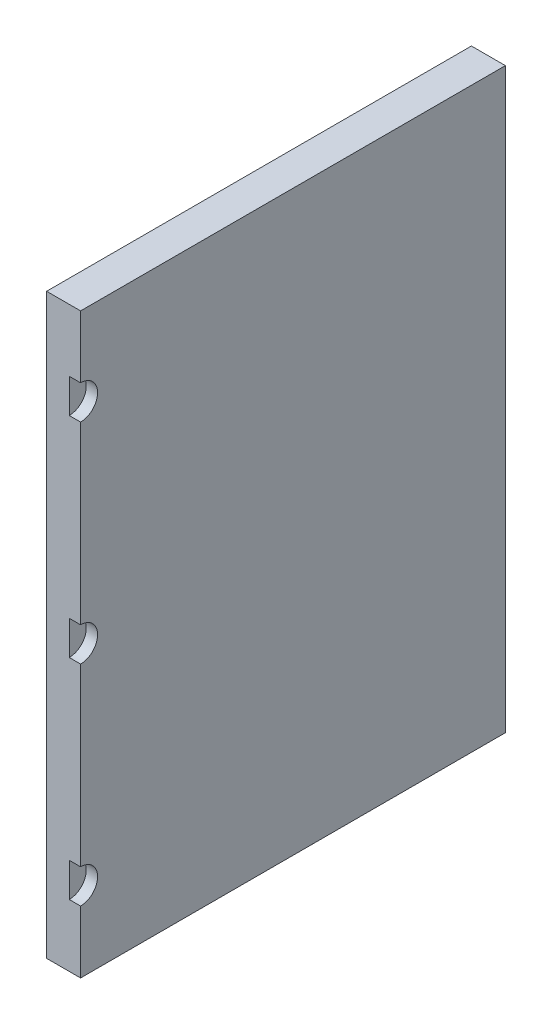
ISO-10303-21;
HEADER;
FILE_DESCRIPTION(('STEP AP214'),'2;1');
FILE_NAME('part.step','',(''),(''),'','','');
FILE_SCHEMA(('AUTOMOTIVE_DESIGN { 1 0 10303 214 1 1 1 1 }'));
ENDSEC;
DATA;
#1=APPLICATION_CONTEXT('core data for automotive mechanical design processes');
#2=APPLICATION_PROTOCOL_DEFINITION('international standard','automotive_design',2000,#1);
#3=PRODUCT_CONTEXT('',#1,'mechanical');
#4=PRODUCT('Part','Part','',(#3));
#5=PRODUCT_RELATED_PRODUCT_CATEGORY('part','',(#4));
#6=PRODUCT_DEFINITION_FORMATION('','',#4);
#7=PRODUCT_DEFINITION_CONTEXT('part definition',#1,'design');
#8=PRODUCT_DEFINITION('design','',#6,#7);
#9=PRODUCT_DEFINITION_SHAPE('','',#8);
#10=(LENGTH_UNIT() NAMED_UNIT(*) SI_UNIT(.MILLI.,.METRE.));
#11=(NAMED_UNIT(*) PLANE_ANGLE_UNIT() SI_UNIT($,.RADIAN.));
#12=(NAMED_UNIT(*) SI_UNIT($,.STERADIAN.) SOLID_ANGLE_UNIT());
#13=UNCERTAINTY_MEASURE_WITH_UNIT(LENGTH_MEASURE(1.E-05),#10,'distance_accuracy_value','');
#14=(GEOMETRIC_REPRESENTATION_CONTEXT(3) GLOBAL_UNCERTAINTY_ASSIGNED_CONTEXT((#13)) GLOBAL_UNIT_ASSIGNED_CONTEXT((#10,
#11,#12)) REPRESENTATION_CONTEXT('',''));
#15=CARTESIAN_POINT('',(0.,0.,0.));
#16=DIRECTION('',(0.,0.,1.));
#17=DIRECTION('',(1.,0.,0.));
#18=AXIS2_PLACEMENT_3D('',#15,#16,#17);
#19=CARTESIAN_POINT('',(4.,12.,39.));
#20=DIRECTION('',(1.,0.,0.));
#21=DIRECTION('',(0.,1.,0.));
#22=AXIS2_PLACEMENT_3D('',#19,#20,#21);
#23=PLANE('',#22);
#24=CARTESIAN_POINT('',(4.,12.,39.));
#25=DIRECTION('',(1.,0.,0.));
#26=DIRECTION('',(0.,1.,0.));
#27=AXIS2_PLACEMENT_3D('',#24,#25,#26);
#28=CIRCLE('',#27,1.5);
#29=CARTESIAN_POINT('',(4.,10.5,39.));
#30=VERTEX_POINT('',#29);
#31=CARTESIAN_POINT('',(4.,13.5,39.));
#32=VERTEX_POINT('',#31);
#33=EDGE_CURVE('E9',#30,#32,#28,.T.);
#34=ORIENTED_EDGE('',*,*,#33,.T.);
#35=DIRECTION('',(0.,1.,0.));
#36=VECTOR('',#35,1.);
#37=CARTESIAN_POINT('',(4.,8.5,39.));
#38=LINE('',#37,#36);
#39=EDGE_CURVE('E171',#30,#32,#38,.T.);
#40=ORIENTED_EDGE('',*,*,#39,.F.);
#41=EDGE_LOOP('',(#34,#40));
#42=FACE_BOUND('',#41,.T.);
#43=ADVANCED_FACE('F15',(#42),#23,.T.);
#44=CARTESIAN_POINT('',(4.,12.,39.));
#45=DIRECTION('',(-1.,0.,0.));
#46=DIRECTION('',(0.,1.,0.));
#47=AXIS2_PLACEMENT_3D('',#44,#45,#46);
#48=CYLINDRICAL_SURFACE('',#47,1.5);
#49=DIRECTION('',(1.,0.,0.));
#50=VECTOR('',#49,1.);
#51=CARTESIAN_POINT('',(4.,13.5,39.));
#52=LINE('',#51,#50);
#53=CARTESIAN_POINT('',(5.,13.5,39.));
#54=VERTEX_POINT('',#53);
#55=EDGE_CURVE('E166',#32,#54,#52,.T.);
#56=ORIENTED_EDGE('',*,*,#55,.F.);
#57=ORIENTED_EDGE('',*,*,#33,.F.);
#58=DIRECTION('',(-1.,0.,0.));
#59=VECTOR('',#58,1.);
#60=CARTESIAN_POINT('',(4.,10.5,39.));
#61=LINE('',#60,#59);
#62=CARTESIAN_POINT('',(5.,10.5,39.));
#63=VERTEX_POINT('',#62);
#64=EDGE_CURVE('E165',#63,#30,#61,.T.);
#65=ORIENTED_EDGE('',*,*,#64,.F.);
#66=CARTESIAN_POINT('',(5.,12.,39.));
#67=DIRECTION('',(1.,0.,0.));
#68=DIRECTION('',(0.,1.,0.));
#69=AXIS2_PLACEMENT_3D('',#66,#67,#68);
#70=CIRCLE('',#69,1.5);
#71=EDGE_CURVE('E135',#63,#54,#70,.T.);
#72=ORIENTED_EDGE('',*,*,#71,.T.);
#73=EDGE_LOOP('',(#56,#57,#65,#72));
#74=FACE_BOUND('',#73,.T.);
#75=ADVANCED_FACE('F183',(#74),#48,.F.);
#76=CARTESIAN_POINT('',(4.,30.5,39.));
#77=DIRECTION('',(1.,0.,0.));
#78=DIRECTION('',(0.,1.,0.));
#79=AXIS2_PLACEMENT_3D('',#76,#77,#78);
#80=PLANE('',#79);
#81=CARTESIAN_POINT('',(4.,30.5,39.));
#82=DIRECTION('',(1.,0.,0.));
#83=DIRECTION('',(0.,1.,0.));
#84=AXIS2_PLACEMENT_3D('',#81,#82,#83);
#85=CIRCLE('',#84,1.5);
#86=CARTESIAN_POINT('',(4.,29.,39.));
#87=VERTEX_POINT('',#86);
#88=CARTESIAN_POINT('',(4.,32.,39.));
#89=VERTEX_POINT('',#88);
#90=EDGE_CURVE('E24',#87,#89,#85,.T.);
#91=ORIENTED_EDGE('',*,*,#90,.T.);
#92=DIRECTION('',(0.,1.,0.));
#93=VECTOR('',#92,1.);
#94=CARTESIAN_POINT('',(4.,17.75,39.));
#95=LINE('',#94,#93);
#96=EDGE_CURVE('E120',#87,#89,#95,.T.);
#97=ORIENTED_EDGE('',*,*,#96,.F.);
#98=EDGE_LOOP('',(#91,#97));
#99=FACE_BOUND('',#98,.T.);
#100=ADVANCED_FACE('F180',(#99),#80,.T.);
#101=CARTESIAN_POINT('',(4.,30.5,39.));
#102=DIRECTION('',(-1.,0.,0.));
#103=DIRECTION('',(0.,1.,0.));
#104=AXIS2_PLACEMENT_3D('',#101,#102,#103);
#105=CYLINDRICAL_SURFACE('',#104,1.5);
#106=DIRECTION('',(1.,0.,0.));
#107=VECTOR('',#106,1.);
#108=CARTESIAN_POINT('',(4.,32.,39.));
#109=LINE('',#108,#107);
#110=CARTESIAN_POINT('',(5.,32.,39.));
#111=VERTEX_POINT('',#110);
#112=EDGE_CURVE('E114',#89,#111,#109,.T.);
#113=ORIENTED_EDGE('',*,*,#112,.F.);
#114=ORIENTED_EDGE('',*,*,#90,.F.);
#115=DIRECTION('',(-1.,0.,0.));
#116=VECTOR('',#115,1.);
#117=CARTESIAN_POINT('',(4.,29.,39.));
#118=LINE('',#117,#116);
#119=CARTESIAN_POINT('',(5.,29.,39.));
#120=VERTEX_POINT('',#119);
#121=EDGE_CURVE('E172',#120,#87,#118,.T.);
#122=ORIENTED_EDGE('',*,*,#121,.F.);
#123=CARTESIAN_POINT('',(5.,30.5,39.));
#124=DIRECTION('',(1.,0.,0.));
#125=DIRECTION('',(0.,1.,0.));
#126=AXIS2_PLACEMENT_3D('',#123,#124,#125);
#127=CIRCLE('',#126,1.5);
#128=EDGE_CURVE('E98',#120,#111,#127,.T.);
#129=ORIENTED_EDGE('',*,*,#128,.T.);
#130=EDGE_LOOP('',(#113,#114,#122,#129));
#131=FACE_BOUND('',#130,.T.);
#132=ADVANCED_FACE('F182',(#131),#105,.F.);
#133=CARTESIAN_POINT('',(4.,49.,39.));
#134=DIRECTION('',(1.,0.,0.));
#135=DIRECTION('',(0.,1.,0.));
#136=AXIS2_PLACEMENT_3D('',#133,#134,#135);
#137=PLANE('',#136);
#138=CARTESIAN_POINT('',(4.,49.,39.));
#139=DIRECTION('',(1.,0.,0.));
#140=DIRECTION('',(0.,1.,0.));
#141=AXIS2_PLACEMENT_3D('',#138,#139,#140);
#142=CIRCLE('',#141,1.5);
#143=CARTESIAN_POINT('',(4.,47.5,39.));
#144=VERTEX_POINT('',#143);
#145=CARTESIAN_POINT('',(4.,50.5,39.));
#146=VERTEX_POINT('',#145);
#147=EDGE_CURVE('E104',#144,#146,#142,.T.);
#148=ORIENTED_EDGE('',*,*,#147,.T.);
#149=DIRECTION('',(0.,1.,0.));
#150=VECTOR('',#149,1.);
#151=CARTESIAN_POINT('',(4.,27.,39.));
#152=LINE('',#151,#150);
#153=EDGE_CURVE('E109',#144,#146,#152,.T.);
#154=ORIENTED_EDGE('',*,*,#153,.F.);
#155=EDGE_LOOP('',(#148,#154));
#156=FACE_BOUND('',#155,.T.);
#157=ADVANCED_FACE('F143',(#156),#137,.T.);
#158=CARTESIAN_POINT('',(4.,49.,39.));
#159=DIRECTION('',(-1.,0.,0.));
#160=DIRECTION('',(0.,1.,0.));
#161=AXIS2_PLACEMENT_3D('',#158,#159,#160);
#162=CYLINDRICAL_SURFACE('',#161,1.5);
#163=DIRECTION('',(1.,0.,0.));
#164=VECTOR('',#163,1.);
#165=CARTESIAN_POINT('',(4.,50.5,39.));
#166=LINE('',#165,#164);
#167=CARTESIAN_POINT('',(5.,50.5,39.));
#168=VERTEX_POINT('',#167);
#169=EDGE_CURVE('E146',#146,#168,#166,.T.);
#170=ORIENTED_EDGE('',*,*,#169,.F.);
#171=ORIENTED_EDGE('',*,*,#147,.F.);
#172=DIRECTION('',(-1.,0.,0.));
#173=VECTOR('',#172,1.);
#174=CARTESIAN_POINT('',(4.,47.5,39.));
#175=LINE('',#174,#173);
#176=CARTESIAN_POINT('',(5.,47.5,39.));
#177=VERTEX_POINT('',#176);
#178=EDGE_CURVE('E101',#177,#144,#175,.T.);
#179=ORIENTED_EDGE('',*,*,#178,.F.);
#180=CARTESIAN_POINT('',(5.,49.,39.));
#181=DIRECTION('',(1.,0.,0.));
#182=DIRECTION('',(0.,1.,0.));
#183=AXIS2_PLACEMENT_3D('',#180,#181,#182);
#184=CIRCLE('',#183,1.5);
#185=EDGE_CURVE('E84',#177,#168,#184,.T.);
#186=ORIENTED_EDGE('',*,*,#185,.T.);
#187=EDGE_LOOP('',(#170,#171,#179,#186));
#188=FACE_BOUND('',#187,.T.);
#189=ADVANCED_FACE('F102',(#188),#162,.F.);
#190=CARTESIAN_POINT('',(5.,5.,1.5));
#191=DIRECTION('',(1.,0.,0.));
#192=DIRECTION('',(0.,1.,0.));
#193=AXIS2_PLACEMENT_3D('',#190,#191,#192);
#194=PLANE('',#193);
#195=DIRECTION('',(0.,1.,0.));
#196=VECTOR('',#195,1.);
#197=CARTESIAN_POINT('',(5.,5.,39.));
#198=LINE('',#197,#196);
#199=CARTESIAN_POINT('',(5.,5.,39.));
#200=VERTEX_POINT('',#199);
#201=EDGE_CURVE('E162',#200,#63,#198,.T.);
#202=ORIENTED_EDGE('',*,*,#201,.F.);
#203=DIRECTION('',(0.,0.,1.));
#204=VECTOR('',#203,1.);
#205=CARTESIAN_POINT('',(5.,5.,1.5));
#206=LINE('',#205,#204);
#207=CARTESIAN_POINT('',(5.,5.,1.5));
#208=VERTEX_POINT('',#207);
#209=EDGE_CURVE('E216',#208,#200,#206,.T.);
#210=ORIENTED_EDGE('',*,*,#209,.F.);
#211=DIRECTION('',(0.,1.,0.));
#212=VECTOR('',#211,1.);
#213=CARTESIAN_POINT('',(5.,5.,1.5));
#214=LINE('',#213,#212);
#215=CARTESIAN_POINT('',(5.,56.,1.5));
#216=VERTEX_POINT('',#215);
#217=EDGE_CURVE('E36',#208,#216,#214,.T.);
#218=ORIENTED_EDGE('',*,*,#217,.T.);
#219=DIRECTION('',(0.,0.,1.));
#220=VECTOR('',#219,1.);
#221=CARTESIAN_POINT('',(5.,56.,1.5));
#222=LINE('',#221,#220);
#223=CARTESIAN_POINT('',(5.,56.,39.));
#224=VERTEX_POINT('',#223);
#225=EDGE_CURVE('E130',#216,#224,#222,.T.);
#226=ORIENTED_EDGE('',*,*,#225,.T.);
#227=DIRECTION('',(0.,1.,0.));
#228=VECTOR('',#227,1.);
#229=CARTESIAN_POINT('',(5.,5.,39.));
#230=LINE('',#229,#228);
#231=EDGE_CURVE('E93',#168,#224,#230,.T.);
#232=ORIENTED_EDGE('',*,*,#231,.F.);
#233=ORIENTED_EDGE('',*,*,#185,.F.);
#234=DIRECTION('',(0.,1.,0.));
#235=VECTOR('',#234,1.);
#236=CARTESIAN_POINT('',(5.,5.,39.));
#237=LINE('',#236,#235);
#238=EDGE_CURVE('E90',#111,#177,#237,.T.);
#239=ORIENTED_EDGE('',*,*,#238,.F.);
#240=ORIENTED_EDGE('',*,*,#128,.F.);
#241=DIRECTION('',(0.,1.,0.));
#242=VECTOR('',#241,1.);
#243=CARTESIAN_POINT('',(5.,5.,39.));
#244=LINE('',#243,#242);
#245=EDGE_CURVE('E170',#54,#120,#244,.T.);
#246=ORIENTED_EDGE('',*,*,#245,.F.);
#247=ORIENTED_EDGE('',*,*,#71,.F.);
#248=EDGE_LOOP('',(#202,#210,#218,#226,#232,#233,#239,#240,#246,#247));
#249=FACE_BOUND('',#248,.T.);
#250=ADVANCED_FACE('F87',(#249),#194,.T.);
#251=CARTESIAN_POINT('',(2.,5.,1.5));
#252=DIRECTION('',(0.,0.,1.));
#253=DIRECTION('',(1.,0.,0.));
#254=AXIS2_PLACEMENT_3D('',#251,#252,#253);
#255=PLANE('',#254);
#256=DIRECTION('',(1.,0.,0.));
#257=VECTOR('',#256,1.);
#258=CARTESIAN_POINT('',(2.,56.,1.5));
#259=LINE('',#258,#257);
#260=CARTESIAN_POINT('',(2.,56.,1.5));
#261=VERTEX_POINT('',#260);
#262=EDGE_CURVE('E126',#261,#216,#259,.T.);
#263=ORIENTED_EDGE('',*,*,#262,.T.);
#264=ORIENTED_EDGE('',*,*,#217,.F.);
#265=DIRECTION('',(1.,0.,0.));
#266=VECTOR('',#265,1.);
#267=CARTESIAN_POINT('',(2.,5.,1.5));
#268=LINE('',#267,#266);
#269=CARTESIAN_POINT('',(2.,5.,1.5));
#270=VERTEX_POINT('',#269);
#271=EDGE_CURVE('E148',#270,#208,#268,.T.);
#272=ORIENTED_EDGE('',*,*,#271,.F.);
#273=DIRECTION('',(0.,1.,0.));
#274=VECTOR('',#273,1.);
#275=CARTESIAN_POINT('',(2.,5.,1.5));
#276=LINE('',#275,#274);
#277=EDGE_CURVE('E212',#270,#261,#276,.T.);
#278=ORIENTED_EDGE('',*,*,#277,.T.);
#279=EDGE_LOOP('',(#263,#264,#272,#278));
#280=FACE_BOUND('',#279,.T.);
#281=ADVANCED_FACE('F299',(#280),#255,.F.);
#282=CARTESIAN_POINT('',(2.,56.,1.5));
#283=DIRECTION('',(0.,1.,0.));
#284=DIRECTION('',(1.,0.,0.));
#285=AXIS2_PLACEMENT_3D('',#282,#283,#284);
#286=PLANE('',#285);
#287=ORIENTED_EDGE('',*,*,#262,.F.);
#288=DIRECTION('',(0.,0.,1.));
#289=VECTOR('',#288,1.);
#290=CARTESIAN_POINT('',(2.,56.,1.5));
#291=LINE('',#290,#289);
#292=CARTESIAN_POINT('',(2.,56.,39.));
#293=VERTEX_POINT('',#292);
#294=EDGE_CURVE('E358',#261,#293,#291,.T.);
#295=ORIENTED_EDGE('',*,*,#294,.T.);
#296=DIRECTION('',(1.,0.,0.));
#297=VECTOR('',#296,1.);
#298=CARTESIAN_POINT('',(2.,56.,39.));
#299=LINE('',#298,#297);
#300=EDGE_CURVE('E154',#293,#224,#299,.T.);
#301=ORIENTED_EDGE('',*,*,#300,.T.);
#302=ORIENTED_EDGE('',*,*,#225,.F.);
#303=EDGE_LOOP('',(#287,#295,#301,#302));
#304=FACE_BOUND('',#303,.T.);
#305=ADVANCED_FACE('F307',(#304),#286,.T.);
#306=CARTESIAN_POINT('',(2.,5.,39.));
#307=DIRECTION('',(0.,0.,1.));
#308=DIRECTION('',(1.,0.,0.));
#309=AXIS2_PLACEMENT_3D('',#306,#307,#308);
#310=PLANE('',#309);
#311=ORIENTED_EDGE('',*,*,#169,.T.);
#312=ORIENTED_EDGE('',*,*,#231,.T.);
#313=ORIENTED_EDGE('',*,*,#300,.F.);
#314=DIRECTION('',(0.,1.,0.));
#315=VECTOR('',#314,1.);
#316=CARTESIAN_POINT('',(2.,5.,39.));
#317=LINE('',#316,#315);
#318=CARTESIAN_POINT('',(2.,5.,39.));
#319=VERTEX_POINT('',#318);
#320=EDGE_CURVE('E230',#319,#293,#317,.T.);
#321=ORIENTED_EDGE('',*,*,#320,.F.);
#322=DIRECTION('',(1.,0.,0.));
#323=VECTOR('',#322,1.);
#324=CARTESIAN_POINT('',(2.,5.,39.));
#325=LINE('',#324,#323);
#326=EDGE_CURVE('E158',#319,#200,#325,.T.);
#327=ORIENTED_EDGE('',*,*,#326,.T.);
#328=ORIENTED_EDGE('',*,*,#201,.T.);
#329=ORIENTED_EDGE('',*,*,#64,.T.);
#330=ORIENTED_EDGE('',*,*,#39,.T.);
#331=ORIENTED_EDGE('',*,*,#55,.T.);
#332=ORIENTED_EDGE('',*,*,#245,.T.);
#333=ORIENTED_EDGE('',*,*,#121,.T.);
#334=ORIENTED_EDGE('',*,*,#96,.T.);
#335=ORIENTED_EDGE('',*,*,#112,.T.);
#336=ORIENTED_EDGE('',*,*,#238,.T.);
#337=ORIENTED_EDGE('',*,*,#178,.T.);
#338=ORIENTED_EDGE('',*,*,#153,.T.);
#339=EDGE_LOOP('',(#311,#312,#313,#321,#327,#328,#329,#330,#331,#332,#333,#334,#335,#336,#337,#338));
#340=FACE_BOUND('',#339,.T.);
#341=ADVANCED_FACE('F111',(#340),#310,.T.);
#342=CARTESIAN_POINT('',(2.,5.,1.5));
#343=DIRECTION('',(0.,1.,0.));
#344=DIRECTION('',(1.,0.,0.));
#345=AXIS2_PLACEMENT_3D('',#342,#343,#344);
#346=PLANE('',#345);
#347=ORIENTED_EDGE('',*,*,#209,.T.);
#348=ORIENTED_EDGE('',*,*,#326,.F.);
#349=DIRECTION('',(0.,0.,1.));
#350=VECTOR('',#349,1.);
#351=CARTESIAN_POINT('',(2.,5.,1.5));
#352=LINE('',#351,#350);
#353=EDGE_CURVE('E213',#270,#319,#352,.T.);
#354=ORIENTED_EDGE('',*,*,#353,.F.);
#355=ORIENTED_EDGE('',*,*,#271,.T.);
#356=EDGE_LOOP('',(#347,#348,#354,#355));
#357=FACE_BOUND('',#356,.T.);
#358=ADVANCED_FACE('F234',(#357),#346,.F.);
#359=CARTESIAN_POINT('',(2.,5.,1.5));
#360=DIRECTION('',(1.,0.,0.));
#361=DIRECTION('',(0.,1.,0.));
#362=AXIS2_PLACEMENT_3D('',#359,#360,#361);
#363=PLANE('',#362);
#364=ORIENTED_EDGE('',*,*,#320,.T.);
#365=ORIENTED_EDGE('',*,*,#294,.F.);
#366=ORIENTED_EDGE('',*,*,#277,.F.);
#367=ORIENTED_EDGE('',*,*,#353,.T.);
#368=EDGE_LOOP('',(#364,#365,#366,#367));
#369=FACE_BOUND('',#368,.T.);
#370=ADVANCED_FACE('F327',(#369),#363,.F.);
#371=CLOSED_SHELL('',(#43,#75,#100,#132,#157,#189,#250,#281,#305,#341,#358,#370));
#372=MANIFOLD_SOLID_BREP('B1',#371);
#373=ADVANCED_BREP_SHAPE_REPRESENTATION('',(#18,#372),#14);
#374=SHAPE_DEFINITION_REPRESENTATION(#9,#373);
ENDSEC;
END-ISO-10303-21;
